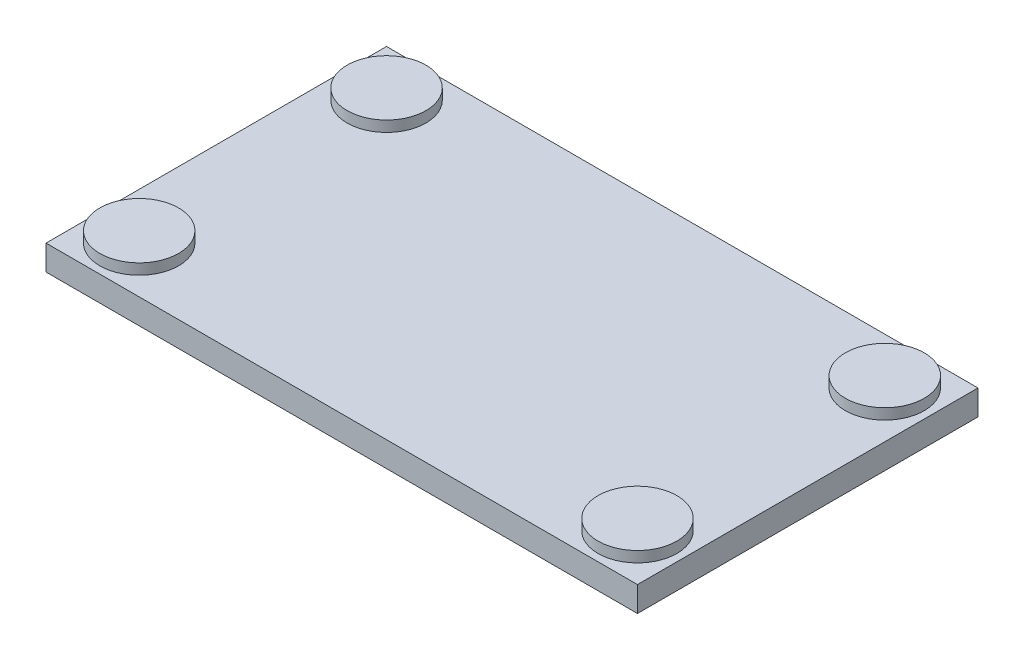
ISO-10303-21;
HEADER;
FILE_DESCRIPTION(('STEP AP214'),'2;1');
FILE_NAME('part.step','',(''),(''),'','','');
FILE_SCHEMA(('AUTOMOTIVE_DESIGN { 1 0 10303 214 1 1 1 1 }'));
ENDSEC;
DATA;
#1=APPLICATION_CONTEXT('core data for automotive mechanical design processes');
#2=APPLICATION_PROTOCOL_DEFINITION('international standard','automotive_design',2000,#1);
#3=PRODUCT_CONTEXT('',#1,'mechanical');
#4=PRODUCT('Part','Part','',(#3));
#5=PRODUCT_RELATED_PRODUCT_CATEGORY('part','',(#4));
#6=PRODUCT_DEFINITION_FORMATION('','',#4);
#7=PRODUCT_DEFINITION_CONTEXT('part definition',#1,'design');
#8=PRODUCT_DEFINITION('design','',#6,#7);
#9=PRODUCT_DEFINITION_SHAPE('','',#8);
#10=(LENGTH_UNIT() NAMED_UNIT(*) SI_UNIT(.MILLI.,.METRE.));
#11=(NAMED_UNIT(*) PLANE_ANGLE_UNIT() SI_UNIT($,.RADIAN.));
#12=(NAMED_UNIT(*) SI_UNIT($,.STERADIAN.) SOLID_ANGLE_UNIT());
#13=UNCERTAINTY_MEASURE_WITH_UNIT(LENGTH_MEASURE(1.E-05),#10,'distance_accuracy_value','');
#14=(GEOMETRIC_REPRESENTATION_CONTEXT(3) GLOBAL_UNCERTAINTY_ASSIGNED_CONTEXT((#13)) GLOBAL_UNIT_ASSIGNED_CONTEXT((#10,
#11,#12)) REPRESENTATION_CONTEXT('',''));
#15=CARTESIAN_POINT('',(0.,0.,0.));
#16=DIRECTION('',(0.,0.,1.));
#17=DIRECTION('',(1.,0.,0.));
#18=AXIS2_PLACEMENT_3D('',#15,#16,#17);
#19=CARTESIAN_POINT('',(82.5,7.,-47.5));
#20=DIRECTION('',(-1.,0.,0.));
#21=DIRECTION('',(0.,0.,1.));
#22=AXIS2_PLACEMENT_3D('',#19,#20,#21);
#23=PLANE('',#22);
#24=DIRECTION('',(0.,0.,-1.));
#25=VECTOR('',#24,1.);
#26=CARTESIAN_POINT('',(82.5,0.,-47.5));
#27=LINE('',#26,#25);
#28=CARTESIAN_POINT('',(82.5,0.,47.5));
#29=VERTEX_POINT('',#28);
#30=CARTESIAN_POINT('',(82.5,0.,-47.5));
#31=VERTEX_POINT('',#30);
#32=EDGE_CURVE('E113',#29,#31,#27,.T.);
#33=ORIENTED_EDGE('',*,*,#32,.T.);
#34=DIRECTION('',(0.,-1.,0.));
#35=VECTOR('',#34,1.);
#36=CARTESIAN_POINT('',(82.5,7.,-47.5));
#37=LINE('',#36,#35);
#38=CARTESIAN_POINT('',(82.5,7.,-47.5));
#39=VERTEX_POINT('',#38);
#40=EDGE_CURVE('E102',#39,#31,#37,.T.);
#41=ORIENTED_EDGE('',*,*,#40,.F.);
#42=DIRECTION('',(0.,0.,-1.));
#43=VECTOR('',#42,1.);
#44=CARTESIAN_POINT('',(82.5,7.,-47.5));
#45=LINE('',#44,#43);
#46=CARTESIAN_POINT('',(82.5,7.,47.5));
#47=VERTEX_POINT('',#46);
#48=EDGE_CURVE('E94',#47,#39,#45,.T.);
#49=ORIENTED_EDGE('',*,*,#48,.F.);
#50=DIRECTION('',(0.,-1.,0.));
#51=VECTOR('',#50,1.);
#52=CARTESIAN_POINT('',(82.5,7.,47.5));
#53=LINE('',#52,#51);
#54=EDGE_CURVE('E109',#47,#29,#53,.T.);
#55=ORIENTED_EDGE('',*,*,#54,.T.);
#56=EDGE_LOOP('',(#33,#41,#49,#55));
#57=FACE_BOUND('',#56,.T.);
#58=ADVANCED_FACE('F41',(#57),#23,.F.);
#59=CARTESIAN_POINT('',(-82.5,7.,-47.5));
#60=DIRECTION('',(0.,0.,1.));
#61=DIRECTION('',(1.,0.,0.));
#62=AXIS2_PLACEMENT_3D('',#59,#60,#61);
#63=PLANE('',#62);
#64=DIRECTION('',(-1.,0.,0.));
#65=VECTOR('',#64,1.);
#66=CARTESIAN_POINT('',(-82.5,0.,-47.5));
#67=LINE('',#66,#65);
#68=CARTESIAN_POINT('',(-82.5,0.,-47.5));
#69=VERTEX_POINT('',#68);
#70=EDGE_CURVE('E100',#31,#69,#67,.T.);
#71=ORIENTED_EDGE('',*,*,#70,.T.);
#72=DIRECTION('',(0.,-1.,0.));
#73=VECTOR('',#72,1.);
#74=CARTESIAN_POINT('',(-82.5,7.,-47.5));
#75=LINE('',#74,#73);
#76=CARTESIAN_POINT('',(-82.5,7.,-47.5));
#77=VERTEX_POINT('',#76);
#78=EDGE_CURVE('E98',#77,#69,#75,.T.);
#79=ORIENTED_EDGE('',*,*,#78,.F.);
#80=DIRECTION('',(-1.,0.,0.));
#81=VECTOR('',#80,1.);
#82=CARTESIAN_POINT('',(-82.5,7.,-47.5));
#83=LINE('',#82,#81);
#84=EDGE_CURVE('E89',#39,#77,#83,.T.);
#85=ORIENTED_EDGE('',*,*,#84,.F.);
#86=ORIENTED_EDGE('',*,*,#40,.T.);
#87=EDGE_LOOP('',(#71,#79,#85,#86));
#88=FACE_BOUND('',#87,.T.);
#89=ADVANCED_FACE('F99',(#88),#63,.F.);
#90=CARTESIAN_POINT('',(-82.5,7.,-47.5));
#91=DIRECTION('',(1.,0.,0.));
#92=DIRECTION('',(0.,0.,-1.));
#93=AXIS2_PLACEMENT_3D('',#90,#91,#92);
#94=PLANE('',#93);
#95=DIRECTION('',(0.,0.,1.));
#96=VECTOR('',#95,1.);
#97=CARTESIAN_POINT('',(-82.5,0.,-47.5));
#98=LINE('',#97,#96);
#99=CARTESIAN_POINT('',(-82.5,0.,47.5));
#100=VERTEX_POINT('',#99);
#101=EDGE_CURVE('E75',#69,#100,#98,.T.);
#102=ORIENTED_EDGE('',*,*,#101,.T.);
#103=DIRECTION('',(0.,-1.,0.));
#104=VECTOR('',#103,1.);
#105=CARTESIAN_POINT('',(-82.5,7.,47.5));
#106=LINE('',#105,#104);
#107=CARTESIAN_POINT('',(-82.5,7.,47.5));
#108=VERTEX_POINT('',#107);
#109=EDGE_CURVE('E103',#108,#100,#106,.T.);
#110=ORIENTED_EDGE('',*,*,#109,.F.);
#111=DIRECTION('',(0.,0.,1.));
#112=VECTOR('',#111,1.);
#113=CARTESIAN_POINT('',(-82.5,7.,-47.5));
#114=LINE('',#113,#112);
#115=EDGE_CURVE('E92',#77,#108,#114,.T.);
#116=ORIENTED_EDGE('',*,*,#115,.F.);
#117=ORIENTED_EDGE('',*,*,#78,.T.);
#118=EDGE_LOOP('',(#102,#110,#116,#117));
#119=FACE_BOUND('',#118,.T.);
#120=ADVANCED_FACE('F105',(#119),#94,.F.);
#121=CARTESIAN_POINT('',(-82.5,7.,47.5));
#122=DIRECTION('',(0.,0.,-1.));
#123=DIRECTION('',(-1.,0.,0.));
#124=AXIS2_PLACEMENT_3D('',#121,#122,#123);
#125=PLANE('',#124);
#126=DIRECTION('',(1.,0.,0.));
#127=VECTOR('',#126,1.);
#128=CARTESIAN_POINT('',(-82.5,0.,47.5));
#129=LINE('',#128,#127);
#130=EDGE_CURVE('E81',#100,#29,#129,.T.);
#131=ORIENTED_EDGE('',*,*,#130,.T.);
#132=ORIENTED_EDGE('',*,*,#54,.F.);
#133=DIRECTION('',(1.,0.,0.));
#134=VECTOR('',#133,1.);
#135=CARTESIAN_POINT('',(-82.5,7.,47.5));
#136=LINE('',#135,#134);
#137=EDGE_CURVE('E58',#108,#47,#136,.T.);
#138=ORIENTED_EDGE('',*,*,#137,.F.);
#139=ORIENTED_EDGE('',*,*,#109,.T.);
#140=EDGE_LOOP('',(#131,#132,#138,#139));
#141=FACE_BOUND('',#140,.T.);
#142=ADVANCED_FACE('F137',(#141),#125,.F.);
#143=CARTESIAN_POINT('',(0.,7.,0.));
#144=DIRECTION('',(0.,1.,0.));
#145=DIRECTION('',(0.,0.,1.));
#146=AXIS2_PLACEMENT_3D('',#143,#144,#145);
#147=PLANE('',#146);
#148=CARTESIAN_POINT('',(69.5,7.,34.5));
#149=DIRECTION('',(0.,1.,0.));
#150=DIRECTION('',(0.,0.,1.));
#151=AXIS2_PLACEMENT_3D('',#148,#149,#150);
#152=CIRCLE('',#151,11.);
#153=CARTESIAN_POINT('',(69.5,7.,45.5));
#154=VERTEX_POINT('',#153);
#155=EDGE_CURVE('E11',#154,#154,#152,.T.);
#156=ORIENTED_EDGE('',*,*,#155,.F.);
#157=EDGE_LOOP('',(#156));
#158=FACE_BOUND('',#157,.T.);
#159=CARTESIAN_POINT('',(69.5,7.,-34.5));
#160=DIRECTION('',(0.,1.,0.));
#161=DIRECTION('',(0.,0.,1.));
#162=AXIS2_PLACEMENT_3D('',#159,#160,#161);
#163=CIRCLE('',#162,11.);
#164=CARTESIAN_POINT('',(69.5,7.,-23.5));
#165=VERTEX_POINT('',#164);
#166=EDGE_CURVE('E170',#165,#165,#163,.T.);
#167=ORIENTED_EDGE('',*,*,#166,.F.);
#168=EDGE_LOOP('',(#167));
#169=FACE_BOUND('',#168,.T.);
#170=CARTESIAN_POINT('',(-69.5,7.,34.5));
#171=DIRECTION('',(0.,1.,0.));
#172=DIRECTION('',(0.,0.,1.));
#173=AXIS2_PLACEMENT_3D('',#170,#171,#172);
#174=CIRCLE('',#173,11.);
#175=CARTESIAN_POINT('',(-69.5,7.,45.5));
#176=VERTEX_POINT('',#175);
#177=EDGE_CURVE('E162',#176,#176,#174,.T.);
#178=ORIENTED_EDGE('',*,*,#177,.F.);
#179=EDGE_LOOP('',(#178));
#180=FACE_BOUND('',#179,.T.);
#181=CARTESIAN_POINT('',(-69.5,7.,-34.5));
#182=DIRECTION('',(0.,1.,0.));
#183=DIRECTION('',(0.,0.,1.));
#184=AXIS2_PLACEMENT_3D('',#181,#182,#183);
#185=CIRCLE('',#184,11.);
#186=CARTESIAN_POINT('',(-69.5,7.,-23.5));
#187=VERTEX_POINT('',#186);
#188=EDGE_CURVE('E50',#187,#187,#185,.T.);
#189=ORIENTED_EDGE('',*,*,#188,.F.);
#190=EDGE_LOOP('',(#189));
#191=FACE_BOUND('',#190,.T.);
#192=ORIENTED_EDGE('',*,*,#48,.T.);
#193=ORIENTED_EDGE('',*,*,#84,.T.);
#194=ORIENTED_EDGE('',*,*,#115,.T.);
#195=ORIENTED_EDGE('',*,*,#137,.T.);
#196=EDGE_LOOP('',(#192,#193,#194,#195));
#197=FACE_BOUND('',#196,.T.);
#198=ADVANCED_FACE('F90',(#158,#169,#180,#191,#197),#147,.T.);
#199=CARTESIAN_POINT('',(0.,0.,0.));
#200=DIRECTION('',(0.,1.,0.));
#201=DIRECTION('',(0.,0.,1.));
#202=AXIS2_PLACEMENT_3D('',#199,#200,#201);
#203=PLANE('',#202);
#204=ORIENTED_EDGE('',*,*,#32,.F.);
#205=ORIENTED_EDGE('',*,*,#130,.F.);
#206=ORIENTED_EDGE('',*,*,#101,.F.);
#207=ORIENTED_EDGE('',*,*,#70,.F.);
#208=EDGE_LOOP('',(#204,#205,#206,#207));
#209=FACE_BOUND('',#208,.T.);
#210=ADVANCED_FACE('F136',(#209),#203,.F.);
#211=CARTESIAN_POINT('',(-69.5,10.,-34.5));
#212=DIRECTION('',(0.,-1.,0.));
#213=DIRECTION('',(0.,0.,-1.));
#214=AXIS2_PLACEMENT_3D('',#211,#212,#213);
#215=CYLINDRICAL_SURFACE('',#214,11.);
#216=CARTESIAN_POINT('',(-69.5,10.,-34.5));
#217=DIRECTION('',(0.,1.,0.));
#218=DIRECTION('',(0.,0.,1.));
#219=AXIS2_PLACEMENT_3D('',#216,#217,#218);
#220=CIRCLE('',#219,11.);
#221=CARTESIAN_POINT('',(-69.5,10.,-23.5));
#222=VERTEX_POINT('',#221);
#223=EDGE_CURVE('E117',#222,#222,#220,.F.);
#224=ORIENTED_EDGE('',*,*,#223,.T.);
#225=EDGE_LOOP('',(#224));
#226=FACE_BOUND('',#225,.T.);
#227=ORIENTED_EDGE('',*,*,#188,.T.);
#228=EDGE_LOOP('',(#227));
#229=FACE_BOUND('',#228,.T.);
#230=ADVANCED_FACE('F133',(#226,#229),#215,.T.);
#231=CARTESIAN_POINT('',(0.,10.,0.));
#232=DIRECTION('',(0.,1.,0.));
#233=DIRECTION('',(0.,0.,1.));
#234=AXIS2_PLACEMENT_3D('',#231,#232,#233);
#235=PLANE('',#234);
#236=ORIENTED_EDGE('',*,*,#223,.F.);
#237=EDGE_LOOP('',(#236));
#238=FACE_BOUND('',#237,.T.);
#239=ADVANCED_FACE('F208',(#238),#235,.T.);
#240=CARTESIAN_POINT('',(-69.5,10.,34.5));
#241=DIRECTION('',(0.,-1.,0.));
#242=DIRECTION('',(0.,0.,-1.));
#243=AXIS2_PLACEMENT_3D('',#240,#241,#242);
#244=CYLINDRICAL_SURFACE('',#243,11.);
#245=CARTESIAN_POINT('',(-69.5,10.,34.5));
#246=DIRECTION('',(0.,1.,0.));
#247=DIRECTION('',(0.,0.,1.));
#248=AXIS2_PLACEMENT_3D('',#245,#246,#247);
#249=CIRCLE('',#248,11.);
#250=CARTESIAN_POINT('',(-69.5,10.,45.5));
#251=VERTEX_POINT('',#250);
#252=EDGE_CURVE('E161',#251,#251,#249,.T.);
#253=ORIENTED_EDGE('',*,*,#252,.F.);
#254=EDGE_LOOP('',(#253));
#255=FACE_BOUND('',#254,.T.);
#256=ORIENTED_EDGE('',*,*,#177,.T.);
#257=EDGE_LOOP('',(#256));
#258=FACE_BOUND('',#257,.T.);
#259=ADVANCED_FACE('F204',(#255,#258),#244,.T.);
#260=CARTESIAN_POINT('',(0.,10.,0.));
#261=DIRECTION('',(0.,1.,0.));
#262=DIRECTION('',(0.,0.,1.));
#263=AXIS2_PLACEMENT_3D('',#260,#261,#262);
#264=PLANE('',#263);
#265=ORIENTED_EDGE('',*,*,#252,.T.);
#266=EDGE_LOOP('',(#265));
#267=FACE_BOUND('',#266,.T.);
#268=ADVANCED_FACE('F200',(#267),#264,.T.);
#269=CARTESIAN_POINT('',(69.5,10.,-34.5));
#270=DIRECTION('',(0.,-1.,0.));
#271=DIRECTION('',(0.,0.,-1.));
#272=AXIS2_PLACEMENT_3D('',#269,#270,#271);
#273=CYLINDRICAL_SURFACE('',#272,11.);
#274=CARTESIAN_POINT('',(69.5,10.,-34.5));
#275=DIRECTION('',(0.,1.,0.));
#276=DIRECTION('',(0.,0.,1.));
#277=AXIS2_PLACEMENT_3D('',#274,#275,#276);
#278=CIRCLE('',#277,11.);
#279=CARTESIAN_POINT('',(69.5,10.,-23.5));
#280=VERTEX_POINT('',#279);
#281=EDGE_CURVE('E166',#280,#280,#278,.T.);
#282=ORIENTED_EDGE('',*,*,#281,.F.);
#283=EDGE_LOOP('',(#282));
#284=FACE_BOUND('',#283,.T.);
#285=ORIENTED_EDGE('',*,*,#166,.T.);
#286=EDGE_LOOP('',(#285));
#287=FACE_BOUND('',#286,.T.);
#288=ADVANCED_FACE('F196',(#284,#287),#273,.T.);
#289=CARTESIAN_POINT('',(0.,10.,0.));
#290=DIRECTION('',(0.,1.,0.));
#291=DIRECTION('',(0.,0.,1.));
#292=AXIS2_PLACEMENT_3D('',#289,#290,#291);
#293=PLANE('',#292);
#294=ORIENTED_EDGE('',*,*,#281,.T.);
#295=EDGE_LOOP('',(#294));
#296=FACE_BOUND('',#295,.T.);
#297=ADVANCED_FACE('F191',(#296),#293,.T.);
#298=CARTESIAN_POINT('',(69.5,10.,34.5));
#299=DIRECTION('',(0.,-1.,0.));
#300=DIRECTION('',(0.,0.,-1.));
#301=AXIS2_PLACEMENT_3D('',#298,#299,#300);
#302=CYLINDRICAL_SURFACE('',#301,11.);
#303=CARTESIAN_POINT('',(69.5,10.,34.5));
#304=DIRECTION('',(0.,1.,0.));
#305=DIRECTION('',(0.,0.,1.));
#306=AXIS2_PLACEMENT_3D('',#303,#304,#305);
#307=CIRCLE('',#306,11.);
#308=CARTESIAN_POINT('',(69.5,10.,45.5));
#309=VERTEX_POINT('',#308);
#310=EDGE_CURVE('E174',#309,#309,#307,.F.);
#311=ORIENTED_EDGE('',*,*,#310,.T.);
#312=EDGE_LOOP('',(#311));
#313=FACE_BOUND('',#312,.T.);
#314=ORIENTED_EDGE('',*,*,#155,.T.);
#315=EDGE_LOOP('',(#314));
#316=FACE_BOUND('',#315,.T.);
#317=ADVANCED_FACE('F182',(#313,#316),#302,.T.);
#318=CARTESIAN_POINT('',(0.,10.,0.));
#319=DIRECTION('',(0.,1.,0.));
#320=DIRECTION('',(0.,0.,1.));
#321=AXIS2_PLACEMENT_3D('',#318,#319,#320);
#322=PLANE('',#321);
#323=ORIENTED_EDGE('',*,*,#310,.F.);
#324=EDGE_LOOP('',(#323));
#325=FACE_BOUND('',#324,.T.);
#326=ADVANCED_FACE('F185',(#325),#322,.T.);
#327=CLOSED_SHELL('',(#58,#89,#120,#142,#198,#210,#230,#239,#259,#268,#288,#297,#317,#326));
#328=MANIFOLD_SOLID_BREP('B2',#327);
#329=ADVANCED_BREP_SHAPE_REPRESENTATION('',(#18,#328),#14);
#330=SHAPE_DEFINITION_REPRESENTATION(#9,#329);
ENDSEC;
END-ISO-10303-21;
